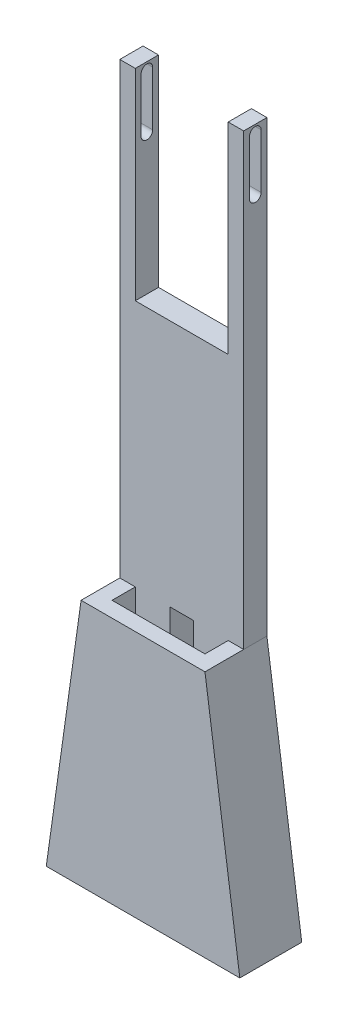
ISO-10303-21;
HEADER;
FILE_DESCRIPTION(('STEP AP214'),'2;1');
FILE_NAME('part.step','',(''),(''),'','','');
FILE_SCHEMA(('AUTOMOTIVE_DESIGN { 1 0 10303 214 1 1 1 1 }'));
ENDSEC;
DATA;
#1=APPLICATION_CONTEXT('core data for automotive mechanical design processes');
#2=APPLICATION_PROTOCOL_DEFINITION('international standard','automotive_design',2000,#1);
#3=PRODUCT_CONTEXT('',#1,'mechanical');
#4=PRODUCT('Part','Part','',(#3));
#5=PRODUCT_RELATED_PRODUCT_CATEGORY('part','',(#4));
#6=PRODUCT_DEFINITION_FORMATION('','',#4);
#7=PRODUCT_DEFINITION_CONTEXT('part definition',#1,'design');
#8=PRODUCT_DEFINITION('design','',#6,#7);
#9=PRODUCT_DEFINITION_SHAPE('','',#8);
#10=(LENGTH_UNIT() NAMED_UNIT(*) SI_UNIT(.MILLI.,.METRE.));
#11=(NAMED_UNIT(*) PLANE_ANGLE_UNIT() SI_UNIT($,.RADIAN.));
#12=(NAMED_UNIT(*) SI_UNIT($,.STERADIAN.) SOLID_ANGLE_UNIT());
#13=UNCERTAINTY_MEASURE_WITH_UNIT(LENGTH_MEASURE(1.E-05),#10,'distance_accuracy_value','');
#14=(GEOMETRIC_REPRESENTATION_CONTEXT(3) GLOBAL_UNCERTAINTY_ASSIGNED_CONTEXT((#13)) GLOBAL_UNIT_ASSIGNED_CONTEXT((#10,
#11,#12)) REPRESENTATION_CONTEXT('',''));
#15=CARTESIAN_POINT('',(0.,0.,0.));
#16=DIRECTION('',(0.,0.,1.));
#17=DIRECTION('',(1.,0.,0.));
#18=AXIS2_PLACEMENT_3D('',#15,#16,#17);
#19=CARTESIAN_POINT('',(-390.335570469799,0.,30.));
#20=DIRECTION('',(-1.,0.,0.));
#21=DIRECTION('',(0.,0.,1.));
#22=AXIS2_PLACEMENT_3D('',#19,#20,#21);
#23=PLANE('',#22);
#24=DIRECTION('',(0.,1.,0.));
#25=VECTOR('',#24,1.);
#26=CARTESIAN_POINT('',(-390.335570469799,450.408690879891,7.5));
#27=LINE('',#26,#25);
#28=CARTESIAN_POINT('',(-390.335570469799,450.408690879891,7.5));
#29=VERTEX_POINT('',#28);
#30=CARTESIAN_POINT('',(-390.335570469799,520.408690879891,7.5));
#31=VERTEX_POINT('',#30);
#32=EDGE_CURVE('E364',#29,#31,#27,.T.);
#33=ORIENTED_EDGE('',*,*,#32,.F.);
#34=CARTESIAN_POINT('',(-390.335570469799,450.408690879891,15.));
#35=DIRECTION('',(1.,0.,0.));
#36=DIRECTION('',(0.,0.,1.));
#37=AXIS2_PLACEMENT_3D('',#34,#35,#36);
#38=CIRCLE('',#37,7.5);
#39=CARTESIAN_POINT('',(-390.335570469799,450.408690879891,22.5));
#40=VERTEX_POINT('',#39);
#41=EDGE_CURVE('E360',#40,#29,#38,.T.);
#42=ORIENTED_EDGE('',*,*,#41,.F.);
#43=DIRECTION('',(0.,-1.,0.));
#44=VECTOR('',#43,1.);
#45=CARTESIAN_POINT('',(-390.335570469799,520.408690879891,22.5));
#46=LINE('',#45,#44);
#47=CARTESIAN_POINT('',(-390.335570469799,520.408690879891,22.5));
#48=VERTEX_POINT('',#47);
#49=EDGE_CURVE('E372',#48,#40,#46,.T.);
#50=ORIENTED_EDGE('',*,*,#49,.F.);
#51=CARTESIAN_POINT('',(-390.335570469799,520.408690879891,15.));
#52=DIRECTION('',(1.,0.,0.));
#53=DIRECTION('',(0.,0.,-1.));
#54=AXIS2_PLACEMENT_3D('',#51,#52,#53);
#55=CIRCLE('',#54,7.5);
#56=EDGE_CURVE('E368',#31,#48,#55,.T.);
#57=ORIENTED_EDGE('',*,*,#56,.F.);
#58=EDGE_LOOP('',(#33,#42,#50,#57));
#59=FACE_BOUND('',#58,.T.);
#60=DIRECTION('',(0.,0.,1.));
#61=VECTOR('',#60,1.);
#62=CARTESIAN_POINT('',(-390.335570469799,-49.5913091201089,0.));
#63=LINE('',#62,#61);
#64=CARTESIAN_POINT('',(-390.335570469799,-49.5913091201089,0.));
#65=VERTEX_POINT('',#64);
#66=CARTESIAN_POINT('',(-390.335570469799,-49.5913091201089,30.));
#67=VERTEX_POINT('',#66);
#68=EDGE_CURVE('E231',#65,#67,#63,.T.);
#69=ORIENTED_EDGE('',*,*,#68,.F.);
#70=DIRECTION('',(0.,1.,0.));
#71=VECTOR('',#70,1.);
#72=CARTESIAN_POINT('',(-390.335570469799,0.,0.));
#73=LINE('',#72,#71);
#74=CARTESIAN_POINT('',(-390.335570469799,530.408690879891,0.));
#75=VERTEX_POINT('',#74);
#76=EDGE_CURVE('E303',#65,#75,#73,.T.);
#77=ORIENTED_EDGE('',*,*,#76,.T.);
#78=DIRECTION('',(0.,0.,-1.));
#79=VECTOR('',#78,1.);
#80=CARTESIAN_POINT('',(-390.335570469799,530.408690879891,30.));
#81=LINE('',#80,#79);
#82=CARTESIAN_POINT('',(-390.335570469799,530.408690879891,30.));
#83=VERTEX_POINT('',#82);
#84=EDGE_CURVE('E311',#83,#75,#81,.T.);
#85=ORIENTED_EDGE('',*,*,#84,.F.);
#86=DIRECTION('',(0.,1.,0.));
#87=VECTOR('',#86,1.);
#88=CARTESIAN_POINT('',(-390.335570469799,0.,30.));
#89=LINE('',#88,#87);
#90=EDGE_CURVE('E282',#67,#83,#89,.T.);
#91=ORIENTED_EDGE('',*,*,#90,.F.);
#92=EDGE_LOOP('',(#69,#77,#85,#91));
#93=FACE_BOUND('',#92,.T.);
#94=ADVANCED_FACE('F45',(#59,#93),#23,.F.);
#95=CARTESIAN_POINT('',(-550.335570469799,-49.5913091201089,80.));
#96=DIRECTION('',(0.,-1.,0.));
#97=DIRECTION('',(0.,0.,-1.));
#98=AXIS2_PLACEMENT_3D('',#95,#96,#97);
#99=PLANE('',#98);
#100=DIRECTION('',(0.,0.,-1.));
#101=VECTOR('',#100,1.);
#102=CARTESIAN_POINT('',(-530.335570469799,-49.5913091201089,60.));
#103=LINE('',#102,#101);
#104=CARTESIAN_POINT('',(-530.335570469799,-49.5913091201089,60.));
#105=VERTEX_POINT('',#104);
#106=CARTESIAN_POINT('',(-530.335570469799,-49.5913091201089,30.));
#107=VERTEX_POINT('',#106);
#108=EDGE_CURVE('E507',#105,#107,#103,.T.);
#109=ORIENTED_EDGE('',*,*,#108,.T.);
#110=DIRECTION('',(-1.,0.,0.));
#111=VECTOR('',#110,1.);
#112=CARTESIAN_POINT('',(-550.335570469799,-49.5913091201089,30.));
#113=LINE('',#112,#111);
#114=CARTESIAN_POINT('',(-550.335570469799,-49.5913091201089,30.));
#115=VERTEX_POINT('',#114);
#116=EDGE_CURVE('E266',#107,#115,#113,.T.);
#117=ORIENTED_EDGE('',*,*,#116,.T.);
#118=DIRECTION('',(0.,0.,-1.));
#119=VECTOR('',#118,1.);
#120=CARTESIAN_POINT('',(-550.335570469799,-49.5913091201089,80.));
#121=LINE('',#120,#119);
#122=CARTESIAN_POINT('',(-550.335570469799,-49.5913091201089,80.));
#123=VERTEX_POINT('',#122);
#124=EDGE_CURVE('E238',#123,#115,#121,.T.);
#125=ORIENTED_EDGE('',*,*,#124,.F.);
#126=DIRECTION('',(-1.,0.,0.));
#127=VECTOR('',#126,1.);
#128=CARTESIAN_POINT('',(-550.335570469799,-49.5913091201089,80.));
#129=LINE('',#128,#127);
#130=CARTESIAN_POINT('',(-390.335570469799,-49.5913091201089,80.));
#131=VERTEX_POINT('',#130);
#132=EDGE_CURVE('E243',#131,#123,#129,.T.);
#133=ORIENTED_EDGE('',*,*,#132,.F.);
#134=DIRECTION('',(0.,0.,-1.));
#135=VECTOR('',#134,1.);
#136=CARTESIAN_POINT('',(-390.335570469799,-49.5913091201089,80.));
#137=LINE('',#136,#135);
#138=EDGE_CURVE('E225',#131,#67,#137,.T.);
#139=ORIENTED_EDGE('',*,*,#138,.T.);
#140=CARTESIAN_POINT('',(-410.335570469799,-49.5913091201089,30.));
#141=VERTEX_POINT('',#140);
#142=EDGE_CURVE('E261',#67,#141,#113,.T.);
#143=ORIENTED_EDGE('',*,*,#142,.T.);
#144=DIRECTION('',(0.,0.,-1.));
#145=VECTOR('',#144,1.);
#146=CARTESIAN_POINT('',(-410.335570469799,-49.5913091201089,60.));
#147=LINE('',#146,#145);
#148=CARTESIAN_POINT('',(-410.335570469799,-49.5913091201089,60.));
#149=VERTEX_POINT('',#148);
#150=EDGE_CURVE('E489',#149,#141,#147,.T.);
#151=ORIENTED_EDGE('',*,*,#150,.F.);
#152=DIRECTION('',(-1.,0.,0.));
#153=VECTOR('',#152,1.);
#154=CARTESIAN_POINT('',(-410.335570469799,-49.5913091201089,60.));
#155=LINE('',#154,#153);
#156=EDGE_CURVE('E475',#149,#105,#155,.T.);
#157=ORIENTED_EDGE('',*,*,#156,.T.);
#158=EDGE_LOOP('',(#109,#117,#125,#133,#139,#143,#151,#157));
#159=FACE_BOUND('',#158,.T.);
#160=ADVANCED_FACE('F252',(#159),#99,.F.);
#161=CARTESIAN_POINT('',(-410.335570469799,0.,30.));
#162=DIRECTION('',(-1.,0.,0.));
#163=DIRECTION('',(0.,0.,1.));
#164=AXIS2_PLACEMENT_3D('',#161,#162,#163);
#165=PLANE('',#164);
#166=DIRECTION('',(0.,1.,0.));
#167=VECTOR('',#166,1.);
#168=CARTESIAN_POINT('',(-410.335570469799,0.,0.));
#169=LINE('',#168,#167);
#170=CARTESIAN_POINT('',(-410.335570469799,270.408690879891,0.));
#171=VERTEX_POINT('',#170);
#172=CARTESIAN_POINT('',(-410.335570469799,530.408690879891,0.));
#173=VERTEX_POINT('',#172);
#174=EDGE_CURVE('E237',#171,#173,#169,.T.);
#175=ORIENTED_EDGE('',*,*,#174,.F.);
#176=DIRECTION('',(0.,0.,1.));
#177=VECTOR('',#176,1.);
#178=CARTESIAN_POINT('',(-410.335570469799,270.408690879891,0.));
#179=LINE('',#178,#177);
#180=CARTESIAN_POINT('',(-410.335570469799,270.408690879891,30.));
#181=VERTEX_POINT('',#180);
#182=EDGE_CURVE('E343',#171,#181,#179,.T.);
#183=ORIENTED_EDGE('',*,*,#182,.T.);
#184=DIRECTION('',(0.,1.,0.));
#185=VECTOR('',#184,1.);
#186=CARTESIAN_POINT('',(-410.335570469799,0.,30.));
#187=LINE('',#186,#185);
#188=CARTESIAN_POINT('',(-410.335570469799,530.408690879891,30.));
#189=VERTEX_POINT('',#188);
#190=EDGE_CURVE('E268',#181,#189,#187,.T.);
#191=ORIENTED_EDGE('',*,*,#190,.T.);
#192=DIRECTION('',(0.,0.,-1.));
#193=VECTOR('',#192,1.);
#194=CARTESIAN_POINT('',(-410.335570469799,530.408690879891,30.));
#195=LINE('',#194,#193);
#196=EDGE_CURVE('E288',#189,#173,#195,.T.);
#197=ORIENTED_EDGE('',*,*,#196,.T.);
#198=EDGE_LOOP('',(#175,#183,#191,#197));
#199=FACE_BOUND('',#198,.T.);
#200=DIRECTION('',(0.,1.,0.));
#201=VECTOR('',#200,1.);
#202=CARTESIAN_POINT('',(-410.335570469799,0.,22.5));
#203=LINE('',#202,#201);
#204=CARTESIAN_POINT('',(-410.335570469799,450.408690879891,22.5));
#205=VERTEX_POINT('',#204);
#206=CARTESIAN_POINT('',(-410.335570469799,520.408690879891,22.5));
#207=VERTEX_POINT('',#206);
#208=EDGE_CURVE('E427',#205,#207,#203,.T.);
#209=ORIENTED_EDGE('',*,*,#208,.F.);
#210=CARTESIAN_POINT('',(-410.335570469799,450.408690879891,15.));
#211=DIRECTION('',(1.,0.,0.));
#212=DIRECTION('',(0.,0.,-1.));
#213=AXIS2_PLACEMENT_3D('',#210,#211,#212);
#214=CIRCLE('',#213,7.5);
#215=CARTESIAN_POINT('',(-410.335570469799,450.408690879891,7.5));
#216=VERTEX_POINT('',#215);
#217=EDGE_CURVE('E11',#216,#205,#214,.F.);
#218=ORIENTED_EDGE('',*,*,#217,.F.);
#219=DIRECTION('',(0.,-1.,0.));
#220=VECTOR('',#219,1.);
#221=CARTESIAN_POINT('',(-410.335570469799,0.,7.5));
#222=LINE('',#221,#220);
#223=CARTESIAN_POINT('',(-410.335570469799,520.408690879891,7.5));
#224=VERTEX_POINT('',#223);
#225=EDGE_CURVE('E413',#224,#216,#222,.T.);
#226=ORIENTED_EDGE('',*,*,#225,.F.);
#227=CARTESIAN_POINT('',(-410.335570469799,520.408690879891,15.));
#228=DIRECTION('',(-1.,0.,0.));
#229=DIRECTION('',(0.,0.,1.));
#230=AXIS2_PLACEMENT_3D('',#227,#228,#229);
#231=CIRCLE('',#230,7.5);
#232=EDGE_CURVE('E420',#207,#224,#231,.T.);
#233=ORIENTED_EDGE('',*,*,#232,.F.);
#234=EDGE_LOOP('',(#209,#218,#226,#233));
#235=FACE_BOUND('',#234,.T.);
#236=ADVANCED_FACE('F47',(#199,#235),#165,.T.);
#237=CARTESIAN_POINT('',(-530.335570469799,0.,30.));
#238=DIRECTION('',(1.,0.,0.));
#239=DIRECTION('',(0.,0.,-1.));
#240=AXIS2_PLACEMENT_3D('',#237,#238,#239);
#241=PLANE('',#240);
#242=CARTESIAN_POINT('',(-530.335570469799,450.408690879891,15.));
#243=DIRECTION('',(-1.,0.,0.));
#244=DIRECTION('',(0.,0.,1.));
#245=AXIS2_PLACEMENT_3D('',#242,#243,#244);
#246=CIRCLE('',#245,7.5);
#247=CARTESIAN_POINT('',(-530.335570469799,450.408690879891,22.5));
#248=VERTEX_POINT('',#247);
#249=CARTESIAN_POINT('',(-530.335570469799,450.408690879891,7.5));
#250=VERTEX_POINT('',#249);
#251=EDGE_CURVE('E54',#248,#250,#246,.F.);
#252=ORIENTED_EDGE('',*,*,#251,.F.);
#253=DIRECTION('',(0.,-1.,0.));
#254=VECTOR('',#253,1.);
#255=CARTESIAN_POINT('',(-530.335570469799,0.,22.5));
#256=LINE('',#255,#254);
#257=CARTESIAN_POINT('',(-530.335570469799,520.408690879891,22.5));
#258=VERTEX_POINT('',#257);
#259=EDGE_CURVE('E423',#258,#248,#256,.T.);
#260=ORIENTED_EDGE('',*,*,#259,.F.);
#261=CARTESIAN_POINT('',(-530.335570469799,520.408690879891,15.));
#262=DIRECTION('',(1.,0.,0.));
#263=DIRECTION('',(0.,0.,-1.));
#264=AXIS2_PLACEMENT_3D('',#261,#262,#263);
#265=CIRCLE('',#264,7.5);
#266=CARTESIAN_POINT('',(-530.335570469799,520.408690879891,7.5));
#267=VERTEX_POINT('',#266);
#268=EDGE_CURVE('E417',#267,#258,#265,.T.);
#269=ORIENTED_EDGE('',*,*,#268,.F.);
#270=DIRECTION('',(0.,1.,0.));
#271=VECTOR('',#270,1.);
#272=CARTESIAN_POINT('',(-530.335570469799,0.,7.5));
#273=LINE('',#272,#271);
#274=EDGE_CURVE('E396',#250,#267,#273,.T.);
#275=ORIENTED_EDGE('',*,*,#274,.F.);
#276=EDGE_LOOP('',(#252,#260,#269,#275));
#277=FACE_BOUND('',#276,.T.);
#278=DIRECTION('',(0.,-1.,0.));
#279=VECTOR('',#278,1.);
#280=CARTESIAN_POINT('',(-530.335570469799,0.,30.));
#281=LINE('',#280,#279);
#282=CARTESIAN_POINT('',(-530.335570469799,530.408690879891,30.));
#283=VERTEX_POINT('',#282);
#284=CARTESIAN_POINT('',(-530.335570469799,270.408690879891,30.));
#285=VERTEX_POINT('',#284);
#286=EDGE_CURVE('E272',#283,#285,#281,.T.);
#287=ORIENTED_EDGE('',*,*,#286,.T.);
#288=DIRECTION('',(0.,0.,1.));
#289=VECTOR('',#288,1.);
#290=CARTESIAN_POINT('',(-530.335570469799,270.408690879891,0.));
#291=LINE('',#290,#289);
#292=CARTESIAN_POINT('',(-530.335570469799,270.408690879891,0.));
#293=VERTEX_POINT('',#292);
#294=EDGE_CURVE('E337',#293,#285,#291,.T.);
#295=ORIENTED_EDGE('',*,*,#294,.F.);
#296=DIRECTION('',(0.,-1.,0.));
#297=VECTOR('',#296,1.);
#298=CARTESIAN_POINT('',(-530.335570469799,0.,0.));
#299=LINE('',#298,#297);
#300=CARTESIAN_POINT('',(-530.335570469799,530.408690879891,0.));
#301=VERTEX_POINT('',#300);
#302=EDGE_CURVE('E292',#301,#293,#299,.T.);
#303=ORIENTED_EDGE('',*,*,#302,.F.);
#304=DIRECTION('',(0.,0.,-1.));
#305=VECTOR('',#304,1.);
#306=CARTESIAN_POINT('',(-530.335570469799,530.408690879891,30.));
#307=LINE('',#306,#305);
#308=EDGE_CURVE('E318',#283,#301,#307,.T.);
#309=ORIENTED_EDGE('',*,*,#308,.F.);
#310=EDGE_LOOP('',(#287,#295,#303,#309));
#311=FACE_BOUND('',#310,.T.);
#312=ADVANCED_FACE('F335',(#277,#311),#241,.T.);
#313=CARTESIAN_POINT('',(2.94435970538069E-12,530.408690879888,30.));
#314=DIRECTION('',(0.,-1.,0.));
#315=DIRECTION('',(1.,0.,0.));
#316=AXIS2_PLACEMENT_3D('',#313,#314,#315);
#317=PLANE('',#316);
#318=DIRECTION('',(-1.,0.,0.));
#319=VECTOR('',#318,1.);
#320=CARTESIAN_POINT('',(2.94435970538069E-12,530.408690879888,0.));
#321=LINE('',#320,#319);
#322=CARTESIAN_POINT('',(-550.335570469799,530.408690879891,0.));
#323=VERTEX_POINT('',#322);
#324=EDGE_CURVE('E295',#301,#323,#321,.T.);
#325=ORIENTED_EDGE('',*,*,#324,.T.);
#326=DIRECTION('',(0.,0.,-1.));
#327=VECTOR('',#326,1.);
#328=CARTESIAN_POINT('',(-550.335570469799,530.408690879891,30.));
#329=LINE('',#328,#327);
#330=CARTESIAN_POINT('',(-550.335570469799,530.408690879891,30.));
#331=VERTEX_POINT('',#330);
#332=EDGE_CURVE('E315',#331,#323,#329,.T.);
#333=ORIENTED_EDGE('',*,*,#332,.F.);
#334=DIRECTION('',(-1.,0.,0.));
#335=VECTOR('',#334,1.);
#336=CARTESIAN_POINT('',(2.94435970538069E-12,530.408690879888,30.));
#337=LINE('',#336,#335);
#338=EDGE_CURVE('E276',#283,#331,#337,.T.);
#339=ORIENTED_EDGE('',*,*,#338,.F.);
#340=ORIENTED_EDGE('',*,*,#308,.T.);
#341=EDGE_LOOP('',(#325,#333,#339,#340));
#342=FACE_BOUND('',#341,.T.);
#343=ADVANCED_FACE('F324',(#342),#317,.F.);
#344=CARTESIAN_POINT('',(-550.335570469799,0.,30.));
#345=DIRECTION('',(1.,0.,0.));
#346=DIRECTION('',(0.,0.,-1.));
#347=AXIS2_PLACEMENT_3D('',#344,#345,#346);
#348=PLANE('',#347);
#349=DIRECTION('',(0.,-1.,0.));
#350=VECTOR('',#349,1.);
#351=CARTESIAN_POINT('',(-550.335570469799,520.408690879891,22.5));
#352=LINE('',#351,#350);
#353=CARTESIAN_POINT('',(-550.335570469799,520.408690879891,22.5));
#354=VERTEX_POINT('',#353);
#355=CARTESIAN_POINT('',(-550.335570469799,450.408690879891,22.5));
#356=VERTEX_POINT('',#355);
#357=EDGE_CURVE('E388',#354,#356,#352,.T.);
#358=ORIENTED_EDGE('',*,*,#357,.T.);
#359=CARTESIAN_POINT('',(-550.335570469799,450.408690879891,15.));
#360=DIRECTION('',(1.,0.,0.));
#361=DIRECTION('',(0.,0.,1.));
#362=AXIS2_PLACEMENT_3D('',#359,#360,#361);
#363=CIRCLE('',#362,7.5);
#364=CARTESIAN_POINT('',(-550.335570469799,450.408690879891,7.5));
#365=VERTEX_POINT('',#364);
#366=EDGE_CURVE('E376',#356,#365,#363,.T.);
#367=ORIENTED_EDGE('',*,*,#366,.T.);
#368=DIRECTION('',(0.,1.,0.));
#369=VECTOR('',#368,1.);
#370=CARTESIAN_POINT('',(-550.335570469799,450.408690879891,7.5));
#371=LINE('',#370,#369);
#372=CARTESIAN_POINT('',(-550.335570469799,520.408690879891,7.5));
#373=VERTEX_POINT('',#372);
#374=EDGE_CURVE('E380',#365,#373,#371,.T.);
#375=ORIENTED_EDGE('',*,*,#374,.T.);
#376=CARTESIAN_POINT('',(-550.335570469799,520.408690879891,15.));
#377=DIRECTION('',(1.,0.,0.));
#378=DIRECTION('',(0.,0.,-1.));
#379=AXIS2_PLACEMENT_3D('',#376,#377,#378);
#380=CIRCLE('',#379,7.5);
#381=EDGE_CURVE('E384',#373,#354,#380,.T.);
#382=ORIENTED_EDGE('',*,*,#381,.T.);
#383=EDGE_LOOP('',(#358,#367,#375,#382));
#384=FACE_BOUND('',#383,.T.);
#385=DIRECTION('',(0.,-1.,0.));
#386=VECTOR('',#385,1.);
#387=CARTESIAN_POINT('',(-550.335570469799,0.,0.));
#388=LINE('',#387,#386);
#389=CARTESIAN_POINT('',(-550.335570469799,-49.5913091201089,0.));
#390=VERTEX_POINT('',#389);
#391=EDGE_CURVE('E61',#323,#390,#388,.T.);
#392=ORIENTED_EDGE('',*,*,#391,.T.);
#393=DIRECTION('',(0.,0.,1.));
#394=VECTOR('',#393,1.);
#395=CARTESIAN_POINT('',(-550.335570469799,-49.5913091201089,0.));
#396=LINE('',#395,#394);
#397=EDGE_CURVE('E356',#390,#115,#396,.T.);
#398=ORIENTED_EDGE('',*,*,#397,.T.);
#399=DIRECTION('',(0.,-1.,0.));
#400=VECTOR('',#399,1.);
#401=CARTESIAN_POINT('',(-550.335570469799,0.,30.));
#402=LINE('',#401,#400);
#403=EDGE_CURVE('E279',#331,#115,#402,.T.);
#404=ORIENTED_EDGE('',*,*,#403,.F.);
#405=ORIENTED_EDGE('',*,*,#332,.T.);
#406=EDGE_LOOP('',(#392,#398,#404,#405));
#407=FACE_BOUND('',#406,.T.);
#408=ADVANCED_FACE('F514',(#384,#407),#348,.F.);
#409=CARTESIAN_POINT('',(0.,-369.591309120109,30.));
#410=DIRECTION('',(0.,1.,0.));
#411=DIRECTION('',(0.,0.,1.));
#412=AXIS2_PLACEMENT_3D('',#409,#410,#411);
#413=PLANE('',#412);
#414=DIRECTION('',(1.,0.,0.));
#415=VECTOR('',#414,1.);
#416=CARTESIAN_POINT('',(0.,-369.591309120109,0.));
#417=LINE('',#416,#415);
#418=CARTESIAN_POINT('',(-595.335570469799,-369.591309120109,0.));
#419=VERTEX_POINT('',#418);
#420=CARTESIAN_POINT('',(-345.335570469799,-369.591309120109,0.));
#421=VERTEX_POINT('',#420);
#422=EDGE_CURVE('E300',#419,#421,#417,.T.);
#423=ORIENTED_EDGE('',*,*,#422,.T.);
#424=DIRECTION('',(0.,0.,1.));
#425=VECTOR('',#424,1.);
#426=CARTESIAN_POINT('',(-345.335570469799,-369.591309120109,0.));
#427=LINE('',#426,#425);
#428=CARTESIAN_POINT('',(-345.335570469799,-369.591309120109,80.));
#429=VERTEX_POINT('',#428);
#430=EDGE_CURVE('E529',#421,#429,#427,.T.);
#431=ORIENTED_EDGE('',*,*,#430,.T.);
#432=DIRECTION('',(1.,0.,0.));
#433=VECTOR('',#432,1.);
#434=CARTESIAN_POINT('',(-390.335570469799,-369.591309120109,80.));
#435=LINE('',#434,#433);
#436=CARTESIAN_POINT('',(-595.335570469799,-369.591309120109,80.));
#437=VERTEX_POINT('',#436);
#438=EDGE_CURVE('E245',#437,#429,#435,.T.);
#439=ORIENTED_EDGE('',*,*,#438,.F.);
#440=DIRECTION('',(0.,0.,1.));
#441=VECTOR('',#440,1.);
#442=CARTESIAN_POINT('',(-595.335570469799,-369.591309120109,0.));
#443=LINE('',#442,#441);
#444=EDGE_CURVE('E353',#419,#437,#443,.T.);
#445=ORIENTED_EDGE('',*,*,#444,.F.);
#446=EDGE_LOOP('',(#423,#431,#439,#445));
#447=FACE_BOUND('',#446,.T.);
#448=ADVANCED_FACE('F535',(#447),#413,.F.);
#449=CARTESIAN_POINT('',(0.,530.408690879891,30.));
#450=DIRECTION('',(0.,-1.,0.));
#451=DIRECTION('',(0.,0.,-1.));
#452=AXIS2_PLACEMENT_3D('',#449,#450,#451);
#453=PLANE('',#452);
#454=DIRECTION('',(-1.,0.,0.));
#455=VECTOR('',#454,1.);
#456=CARTESIAN_POINT('',(0.,530.408690879891,0.));
#457=LINE('',#456,#455);
#458=EDGE_CURVE('E273',#75,#173,#457,.T.);
#459=ORIENTED_EDGE('',*,*,#458,.T.);
#460=ORIENTED_EDGE('',*,*,#196,.F.);
#461=DIRECTION('',(-1.,0.,0.));
#462=VECTOR('',#461,1.);
#463=CARTESIAN_POINT('',(0.,530.408690879891,30.));
#464=LINE('',#463,#462);
#465=EDGE_CURVE('E285',#83,#189,#464,.T.);
#466=ORIENTED_EDGE('',*,*,#465,.F.);
#467=ORIENTED_EDGE('',*,*,#84,.T.);
#468=EDGE_LOOP('',(#459,#460,#466,#467));
#469=FACE_BOUND('',#468,.T.);
#470=ADVANCED_FACE('F544',(#469),#453,.F.);
#471=CARTESIAN_POINT('',(0.,0.,30.));
#472=DIRECTION('',(0.,0.,1.));
#473=DIRECTION('',(1.,0.,0.));
#474=AXIS2_PLACEMENT_3D('',#471,#472,#473);
#475=PLANE('',#474);
#476=DIRECTION('',(1.,0.,0.));
#477=VECTOR('',#476,1.);
#478=CARTESIAN_POINT('',(-530.335570469799,270.408690879891,30.));
#479=LINE('',#478,#477);
#480=EDGE_CURVE('E350',#285,#181,#479,.T.);
#481=ORIENTED_EDGE('',*,*,#480,.F.);
#482=ORIENTED_EDGE('',*,*,#286,.F.);
#483=ORIENTED_EDGE('',*,*,#338,.T.);
#484=ORIENTED_EDGE('',*,*,#403,.T.);
#485=ORIENTED_EDGE('',*,*,#116,.F.);
#486=DIRECTION('',(0.,-1.,0.));
#487=VECTOR('',#486,1.);
#488=CARTESIAN_POINT('',(-530.335570469799,-49.5913091201089,30.));
#489=LINE('',#488,#487);
#490=CARTESIAN_POINT('',(-530.335570469799,-349.591309120109,30.));
#491=VERTEX_POINT('',#490);
#492=EDGE_CURVE('E465',#107,#491,#489,.T.);
#493=ORIENTED_EDGE('',*,*,#492,.T.);
#494=DIRECTION('',(1.,0.,0.));
#495=VECTOR('',#494,1.);
#496=CARTESIAN_POINT('',(-530.335570469799,-349.591309120109,30.));
#497=LINE('',#496,#495);
#498=CARTESIAN_POINT('',(-410.335570469799,-349.591309120109,30.));
#499=VERTEX_POINT('',#498);
#500=EDGE_CURVE('E492',#491,#499,#497,.T.);
#501=ORIENTED_EDGE('',*,*,#500,.T.);
#502=DIRECTION('',(0.,1.,0.));
#503=VECTOR('',#502,1.);
#504=CARTESIAN_POINT('',(-410.335570469799,-349.591309120109,30.));
#505=LINE('',#504,#503);
#506=EDGE_CURVE('E480',#499,#141,#505,.T.);
#507=ORIENTED_EDGE('',*,*,#506,.T.);
#508=ORIENTED_EDGE('',*,*,#142,.F.);
#509=ORIENTED_EDGE('',*,*,#90,.T.);
#510=ORIENTED_EDGE('',*,*,#465,.T.);
#511=ORIENTED_EDGE('',*,*,#190,.F.);
#512=EDGE_LOOP('',(#481,#482,#483,#484,#485,#493,#501,#507,#508,#509,#510,#511));
#513=FACE_BOUND('',#512,.T.);
#514=DIRECTION('',(-1.,0.,0.));
#515=VECTOR('',#514,1.);
#516=CARTESIAN_POINT('',(-455.335570469799,-49.5913091201089,30.));
#517=LINE('',#516,#515);
#518=CARTESIAN_POINT('',(-455.335570469799,-49.5913091201089,30.));
#519=VERTEX_POINT('',#518);
#520=CARTESIAN_POINT('',(-485.335570469799,-49.5913091201089,30.));
#521=VERTEX_POINT('',#520);
#522=EDGE_CURVE('E430',#519,#521,#517,.T.);
#523=ORIENTED_EDGE('',*,*,#522,.F.);
#524=DIRECTION('',(0.,1.,0.));
#525=VECTOR('',#524,1.);
#526=CARTESIAN_POINT('',(-455.335570469799,-329.591309120109,30.));
#527=LINE('',#526,#525);
#528=CARTESIAN_POINT('',(-455.335570469799,-329.591309120109,30.));
#529=VERTEX_POINT('',#528);
#530=EDGE_CURVE('E436',#529,#519,#527,.T.);
#531=ORIENTED_EDGE('',*,*,#530,.F.);
#532=DIRECTION('',(1.,0.,0.));
#533=VECTOR('',#532,1.);
#534=CARTESIAN_POINT('',(-485.335570469799,-329.591309120109,30.));
#535=LINE('',#534,#533);
#536=CARTESIAN_POINT('',(-485.335570469799,-329.591309120109,30.));
#537=VERTEX_POINT('',#536);
#538=EDGE_CURVE('E455',#537,#529,#535,.T.);
#539=ORIENTED_EDGE('',*,*,#538,.F.);
#540=DIRECTION('',(0.,-1.,0.));
#541=VECTOR('',#540,1.);
#542=CARTESIAN_POINT('',(-485.335570469799,-49.5913091201089,30.));
#543=LINE('',#542,#541);
#544=EDGE_CURVE('E451',#521,#537,#543,.T.);
#545=ORIENTED_EDGE('',*,*,#544,.F.);
#546=EDGE_LOOP('',(#523,#531,#539,#545));
#547=FACE_BOUND('',#546,.T.);
#548=ADVANCED_FACE('F546',(#513,#547),#475,.T.);
#549=CARTESIAN_POINT('',(0.,0.,0.));
#550=DIRECTION('',(0.,0.,1.));
#551=DIRECTION('',(1.,0.,0.));
#552=AXIS2_PLACEMENT_3D('',#549,#550,#551);
#553=PLANE('',#552);
#554=ORIENTED_EDGE('',*,*,#302,.T.);
#555=DIRECTION('',(1.,0.,0.));
#556=VECTOR('',#555,1.);
#557=CARTESIAN_POINT('',(-530.335570469799,270.408690879891,0.));
#558=LINE('',#557,#556);
#559=EDGE_CURVE('E344',#293,#171,#558,.T.);
#560=ORIENTED_EDGE('',*,*,#559,.T.);
#561=ORIENTED_EDGE('',*,*,#174,.T.);
#562=ORIENTED_EDGE('',*,*,#458,.F.);
#563=ORIENTED_EDGE('',*,*,#76,.F.);
#564=DIRECTION('',(-0.139254831399099,0.990256578838035,0.));
#565=VECTOR('',#564,1.);
#566=CARTESIAN_POINT('',(-345.335570469799,-369.591309120109,0.));
#567=LINE('',#566,#565);
#568=EDGE_CURVE('E249',#421,#65,#567,.T.);
#569=ORIENTED_EDGE('',*,*,#568,.F.);
#570=ORIENTED_EDGE('',*,*,#422,.F.);
#571=DIRECTION('',(-0.139254831399099,-0.990256578838035,0.));
#572=VECTOR('',#571,1.);
#573=CARTESIAN_POINT('',(-595.335570469799,-369.591309120109,0.));
#574=LINE('',#573,#572);
#575=EDGE_CURVE('E518',#390,#419,#574,.T.);
#576=ORIENTED_EDGE('',*,*,#575,.F.);
#577=ORIENTED_EDGE('',*,*,#391,.F.);
#578=ORIENTED_EDGE('',*,*,#324,.F.);
#579=EDGE_LOOP('',(#554,#560,#561,#562,#563,#569,#570,#576,#577,#578));
#580=FACE_BOUND('',#579,.T.);
#581=DIRECTION('',(0.,1.,0.));
#582=VECTOR('',#581,1.);
#583=CARTESIAN_POINT('',(-455.335570469799,-329.591309120109,0.));
#584=LINE('',#583,#582);
#585=CARTESIAN_POINT('',(-455.335570469799,-329.591309120109,0.));
#586=VERTEX_POINT('',#585);
#587=CARTESIAN_POINT('',(-455.335570469799,-49.5913091201089,0.));
#588=VERTEX_POINT('',#587);
#589=EDGE_CURVE('E444',#586,#588,#584,.T.);
#590=ORIENTED_EDGE('',*,*,#589,.T.);
#591=DIRECTION('',(-1.,0.,0.));
#592=VECTOR('',#591,1.);
#593=CARTESIAN_POINT('',(-455.335570469799,-49.5913091201089,0.));
#594=LINE('',#593,#592);
#595=CARTESIAN_POINT('',(-485.335570469799,-49.5913091201089,0.));
#596=VERTEX_POINT('',#595);
#597=EDGE_CURVE('E431',#588,#596,#594,.T.);
#598=ORIENTED_EDGE('',*,*,#597,.T.);
#599=DIRECTION('',(0.,-1.,0.));
#600=VECTOR('',#599,1.);
#601=CARTESIAN_POINT('',(-485.335570469799,-49.5913091201089,0.));
#602=LINE('',#601,#600);
#603=CARTESIAN_POINT('',(-485.335570469799,-329.591309120109,0.));
#604=VERTEX_POINT('',#603);
#605=EDGE_CURVE('E435',#596,#604,#602,.T.);
#606=ORIENTED_EDGE('',*,*,#605,.T.);
#607=DIRECTION('',(1.,0.,0.));
#608=VECTOR('',#607,1.);
#609=CARTESIAN_POINT('',(-485.335570469799,-329.591309120109,0.));
#610=LINE('',#609,#608);
#611=EDGE_CURVE('E440',#604,#586,#610,.T.);
#612=ORIENTED_EDGE('',*,*,#611,.T.);
#613=EDGE_LOOP('',(#590,#598,#606,#612));
#614=FACE_BOUND('',#613,.T.);
#615=ADVANCED_FACE('F330',(#580,#614),#553,.F.);
#616=CARTESIAN_POINT('',(0.,0.,80.));
#617=DIRECTION('',(0.,0.,-1.));
#618=DIRECTION('',(-1.,0.,0.));
#619=AXIS2_PLACEMENT_3D('',#616,#617,#618);
#620=PLANE('',#619);
#621=ORIENTED_EDGE('',*,*,#438,.T.);
#622=DIRECTION('',(-0.139254831399099,0.990256578838035,0.));
#623=VECTOR('',#622,1.);
#624=CARTESIAN_POINT('',(-345.335570469799,-369.591309120109,80.));
#625=LINE('',#624,#623);
#626=EDGE_CURVE('E229',#429,#131,#625,.T.);
#627=ORIENTED_EDGE('',*,*,#626,.T.);
#628=ORIENTED_EDGE('',*,*,#132,.T.);
#629=DIRECTION('',(-0.139254831399099,-0.990256578838035,0.));
#630=VECTOR('',#629,1.);
#631=CARTESIAN_POINT('',(-595.335570469799,-369.591309120109,80.));
#632=LINE('',#631,#630);
#633=EDGE_CURVE('E248',#123,#437,#632,.T.);
#634=ORIENTED_EDGE('',*,*,#633,.T.);
#635=EDGE_LOOP('',(#621,#627,#628,#634));
#636=FACE_BOUND('',#635,.T.);
#637=ADVANCED_FACE('F241',(#636),#620,.F.);
#638=CARTESIAN_POINT('',(-530.335570469799,-49.5913091201089,60.));
#639=DIRECTION('',(1.,0.,0.));
#640=DIRECTION('',(0.,0.,-1.));
#641=AXIS2_PLACEMENT_3D('',#638,#639,#640);
#642=PLANE('',#641);
#643=ORIENTED_EDGE('',*,*,#492,.F.);
#644=ORIENTED_EDGE('',*,*,#108,.F.);
#645=DIRECTION('',(0.,-1.,0.));
#646=VECTOR('',#645,1.);
#647=CARTESIAN_POINT('',(-530.335570469799,-49.5913091201089,60.));
#648=LINE('',#647,#646);
#649=CARTESIAN_POINT('',(-530.335570469799,-349.591309120109,60.));
#650=VERTEX_POINT('',#649);
#651=EDGE_CURVE('E479',#105,#650,#648,.T.);
#652=ORIENTED_EDGE('',*,*,#651,.T.);
#653=DIRECTION('',(0.,0.,-1.));
#654=VECTOR('',#653,1.);
#655=CARTESIAN_POINT('',(-530.335570469799,-349.591309120109,60.));
#656=LINE('',#655,#654);
#657=EDGE_CURVE('E504',#650,#491,#656,.T.);
#658=ORIENTED_EDGE('',*,*,#657,.T.);
#659=EDGE_LOOP('',(#643,#644,#652,#658));
#660=FACE_BOUND('',#659,.T.);
#661=ADVANCED_FACE('F560',(#660),#642,.T.);
#662=CARTESIAN_POINT('',(-530.335570469799,-349.591309120109,60.));
#663=DIRECTION('',(0.,1.,0.));
#664=DIRECTION('',(0.,0.,1.));
#665=AXIS2_PLACEMENT_3D('',#662,#663,#664);
#666=PLANE('',#665);
#667=ORIENTED_EDGE('',*,*,#500,.F.);
#668=ORIENTED_EDGE('',*,*,#657,.F.);
#669=DIRECTION('',(1.,0.,0.));
#670=VECTOR('',#669,1.);
#671=CARTESIAN_POINT('',(-530.335570469799,-349.591309120109,60.));
#672=LINE('',#671,#670);
#673=CARTESIAN_POINT('',(-410.335570469799,-349.591309120109,60.));
#674=VERTEX_POINT('',#673);
#675=EDGE_CURVE('E483',#650,#674,#672,.T.);
#676=ORIENTED_EDGE('',*,*,#675,.T.);
#677=DIRECTION('',(0.,0.,-1.));
#678=VECTOR('',#677,1.);
#679=CARTESIAN_POINT('',(-410.335570469799,-349.591309120109,60.));
#680=LINE('',#679,#678);
#681=EDGE_CURVE('E500',#674,#499,#680,.T.);
#682=ORIENTED_EDGE('',*,*,#681,.T.);
#683=EDGE_LOOP('',(#667,#668,#676,#682));
#684=FACE_BOUND('',#683,.T.);
#685=ADVANCED_FACE('F563',(#684),#666,.T.);
#686=CARTESIAN_POINT('',(-410.335570469799,-349.591309120109,60.));
#687=DIRECTION('',(-1.,0.,0.));
#688=DIRECTION('',(0.,0.,1.));
#689=AXIS2_PLACEMENT_3D('',#686,#687,#688);
#690=PLANE('',#689);
#691=ORIENTED_EDGE('',*,*,#506,.F.);
#692=ORIENTED_EDGE('',*,*,#681,.F.);
#693=DIRECTION('',(0.,1.,0.));
#694=VECTOR('',#693,1.);
#695=CARTESIAN_POINT('',(-410.335570469799,-349.591309120109,60.));
#696=LINE('',#695,#694);
#697=EDGE_CURVE('E486',#674,#149,#696,.T.);
#698=ORIENTED_EDGE('',*,*,#697,.T.);
#699=ORIENTED_EDGE('',*,*,#150,.T.);
#700=EDGE_LOOP('',(#691,#692,#698,#699));
#701=FACE_BOUND('',#700,.T.);
#702=ADVANCED_FACE('F552',(#701),#690,.T.);
#703=CARTESIAN_POINT('',(0.,0.,60.));
#704=DIRECTION('',(0.,0.,1.));
#705=DIRECTION('',(1.,0.,0.));
#706=AXIS2_PLACEMENT_3D('',#703,#704,#705);
#707=PLANE('',#706);
#708=ORIENTED_EDGE('',*,*,#156,.F.);
#709=ORIENTED_EDGE('',*,*,#697,.F.);
#710=ORIENTED_EDGE('',*,*,#675,.F.);
#711=ORIENTED_EDGE('',*,*,#651,.F.);
#712=EDGE_LOOP('',(#708,#709,#710,#711));
#713=FACE_BOUND('',#712,.T.);
#714=ADVANCED_FACE('F557',(#713),#707,.F.);
#715=CARTESIAN_POINT('',(-455.335570469799,-49.5913091201089,0.));
#716=DIRECTION('',(0.,1.,0.));
#717=DIRECTION('',(-1.,0.,0.));
#718=AXIS2_PLACEMENT_3D('',#715,#716,#717);
#719=PLANE('',#718);
#720=ORIENTED_EDGE('',*,*,#522,.T.);
#721=DIRECTION('',(0.,0.,1.));
#722=VECTOR('',#721,1.);
#723=CARTESIAN_POINT('',(-485.335570469799,-49.5913091201089,0.));
#724=LINE('',#723,#722);
#725=EDGE_CURVE('E448',#596,#521,#724,.T.);
#726=ORIENTED_EDGE('',*,*,#725,.F.);
#727=ORIENTED_EDGE('',*,*,#597,.F.);
#728=DIRECTION('',(0.,0.,1.));
#729=VECTOR('',#728,1.);
#730=CARTESIAN_POINT('',(-455.335570469799,-49.5913091201089,0.));
#731=LINE('',#730,#729);
#732=EDGE_CURVE('E462',#588,#519,#731,.T.);
#733=ORIENTED_EDGE('',*,*,#732,.T.);
#734=EDGE_LOOP('',(#720,#726,#727,#733));
#735=FACE_BOUND('',#734,.T.);
#736=ADVANCED_FACE('F667',(#735),#719,.F.);
#737=CARTESIAN_POINT('',(-455.335570469799,-329.591309120109,0.));
#738=DIRECTION('',(1.,0.,0.));
#739=DIRECTION('',(0.,0.,-1.));
#740=AXIS2_PLACEMENT_3D('',#737,#738,#739);
#741=PLANE('',#740);
#742=ORIENTED_EDGE('',*,*,#530,.T.);
#743=ORIENTED_EDGE('',*,*,#732,.F.);
#744=ORIENTED_EDGE('',*,*,#589,.F.);
#745=DIRECTION('',(0.,0.,1.));
#746=VECTOR('',#745,1.);
#747=CARTESIAN_POINT('',(-455.335570469799,-329.591309120109,0.));
#748=LINE('',#747,#746);
#749=EDGE_CURVE('E466',#586,#529,#748,.T.);
#750=ORIENTED_EDGE('',*,*,#749,.T.);
#751=EDGE_LOOP('',(#742,#743,#744,#750));
#752=FACE_BOUND('',#751,.T.);
#753=ADVANCED_FACE('F664',(#752),#741,.F.);
#754=CARTESIAN_POINT('',(-485.335570469799,-329.591309120109,0.));
#755=DIRECTION('',(0.,-1.,0.));
#756=DIRECTION('',(0.,0.,-1.));
#757=AXIS2_PLACEMENT_3D('',#754,#755,#756);
#758=PLANE('',#757);
#759=ORIENTED_EDGE('',*,*,#538,.T.);
#760=ORIENTED_EDGE('',*,*,#749,.F.);
#761=ORIENTED_EDGE('',*,*,#611,.F.);
#762=DIRECTION('',(0.,0.,1.));
#763=VECTOR('',#762,1.);
#764=CARTESIAN_POINT('',(-485.335570469799,-329.591309120109,0.));
#765=LINE('',#764,#763);
#766=EDGE_CURVE('E469',#604,#537,#765,.T.);
#767=ORIENTED_EDGE('',*,*,#766,.T.);
#768=EDGE_LOOP('',(#759,#760,#761,#767));
#769=FACE_BOUND('',#768,.T.);
#770=ADVANCED_FACE('F630',(#769),#758,.F.);
#771=CARTESIAN_POINT('',(-485.335570469799,-49.5913091201089,0.));
#772=DIRECTION('',(-1.,0.,0.));
#773=DIRECTION('',(0.,0.,1.));
#774=AXIS2_PLACEMENT_3D('',#771,#772,#773);
#775=PLANE('',#774);
#776=ORIENTED_EDGE('',*,*,#544,.T.);
#777=ORIENTED_EDGE('',*,*,#766,.F.);
#778=ORIENTED_EDGE('',*,*,#605,.F.);
#779=ORIENTED_EDGE('',*,*,#725,.T.);
#780=EDGE_LOOP('',(#776,#777,#778,#779));
#781=FACE_BOUND('',#780,.T.);
#782=ADVANCED_FACE('F622',(#781),#775,.F.);
#783=CARTESIAN_POINT('',(-550.335570469799,450.408690879891,7.5));
#784=DIRECTION('',(0.,0.,-1.));
#785=DIRECTION('',(-1.,0.,0.));
#786=AXIS2_PLACEMENT_3D('',#783,#784,#785);
#787=PLANE('',#786);
#788=ORIENTED_EDGE('',*,*,#225,.T.);
#789=DIRECTION('',(1.,0.,0.));
#790=VECTOR('',#789,1.);
#791=CARTESIAN_POINT('',(-550.335570469799,450.408690879891,7.5));
#792=LINE('',#791,#790);
#793=EDGE_CURVE('E392',#216,#29,#792,.T.);
#794=ORIENTED_EDGE('',*,*,#793,.T.);
#795=ORIENTED_EDGE('',*,*,#32,.T.);
#796=DIRECTION('',(1.,0.,0.));
#797=VECTOR('',#796,1.);
#798=CARTESIAN_POINT('',(-550.335570469799,520.408690879891,7.5));
#799=LINE('',#798,#797);
#800=EDGE_CURVE('E407',#224,#31,#799,.T.);
#801=ORIENTED_EDGE('',*,*,#800,.F.);
#802=EDGE_LOOP('',(#788,#794,#795,#801));
#803=FACE_BOUND('',#802,.T.);
#804=ADVANCED_FACE('F612',(#803),#787,.F.);
#805=CARTESIAN_POINT('',(-550.335570469799,520.408690879891,15.));
#806=DIRECTION('',(1.,0.,0.));
#807=DIRECTION('',(0.,0.,-1.));
#808=AXIS2_PLACEMENT_3D('',#805,#806,#807);
#809=CYLINDRICAL_SURFACE('',#808,7.5);
#810=ORIENTED_EDGE('',*,*,#232,.T.);
#811=ORIENTED_EDGE('',*,*,#800,.T.);
#812=ORIENTED_EDGE('',*,*,#56,.T.);
#813=DIRECTION('',(1.,0.,0.));
#814=VECTOR('',#813,1.);
#815=CARTESIAN_POINT('',(-550.335570469799,520.408690879891,22.5));
#816=LINE('',#815,#814);
#817=EDGE_CURVE('E402',#207,#48,#816,.T.);
#818=ORIENTED_EDGE('',*,*,#817,.F.);
#819=EDGE_LOOP('',(#810,#811,#812,#818));
#820=FACE_BOUND('',#819,.T.);
#821=ADVANCED_FACE('F619',(#820),#809,.F.);
#822=CARTESIAN_POINT('',(-550.335570469799,520.408690879891,22.5));
#823=DIRECTION('',(0.,0.,1.));
#824=DIRECTION('',(1.,0.,0.));
#825=AXIS2_PLACEMENT_3D('',#822,#823,#824);
#826=PLANE('',#825);
#827=ORIENTED_EDGE('',*,*,#208,.T.);
#828=ORIENTED_EDGE('',*,*,#817,.T.);
#829=ORIENTED_EDGE('',*,*,#49,.T.);
#830=DIRECTION('',(1.,0.,0.));
#831=VECTOR('',#830,1.);
#832=CARTESIAN_POINT('',(-550.335570469799,450.408690879891,22.5));
#833=LINE('',#832,#831);
#834=EDGE_CURVE('E397',#205,#40,#833,.T.);
#835=ORIENTED_EDGE('',*,*,#834,.F.);
#836=EDGE_LOOP('',(#827,#828,#829,#835));
#837=FACE_BOUND('',#836,.T.);
#838=ADVANCED_FACE('F628',(#837),#826,.F.);
#839=CARTESIAN_POINT('',(-550.335570469799,450.408690879891,15.));
#840=DIRECTION('',(1.,0.,0.));
#841=DIRECTION('',(0.,0.,-1.));
#842=AXIS2_PLACEMENT_3D('',#839,#840,#841);
#843=CYLINDRICAL_SURFACE('',#842,7.5);
#844=ORIENTED_EDGE('',*,*,#793,.F.);
#845=ORIENTED_EDGE('',*,*,#217,.T.);
#846=ORIENTED_EDGE('',*,*,#834,.T.);
#847=ORIENTED_EDGE('',*,*,#41,.T.);
#848=EDGE_LOOP('',(#844,#845,#846,#847));
#849=FACE_BOUND('',#848,.T.);
#850=ADVANCED_FACE('F642',(#849),#843,.F.);
#851=EDGE_CURVE('E393',#356,#248,#833,.T.);
#852=ORIENTED_EDGE('',*,*,#851,.T.);
#853=ORIENTED_EDGE('',*,*,#251,.T.);
#854=EDGE_CURVE('E408',#365,#250,#792,.T.);
#855=ORIENTED_EDGE('',*,*,#854,.F.);
#856=ORIENTED_EDGE('',*,*,#366,.F.);
#857=EDGE_LOOP('',(#852,#853,#855,#856));
#858=FACE_BOUND('',#857,.T.);
#859=ADVANCED_FACE('F603',(#858),#843,.F.);
#860=ORIENTED_EDGE('',*,*,#259,.T.);
#861=ORIENTED_EDGE('',*,*,#851,.F.);
#862=ORIENTED_EDGE('',*,*,#357,.F.);
#863=EDGE_CURVE('E398',#354,#258,#816,.T.);
#864=ORIENTED_EDGE('',*,*,#863,.T.);
#865=EDGE_LOOP('',(#860,#861,#862,#864));
#866=FACE_BOUND('',#865,.T.);
#867=ADVANCED_FACE('F600',(#866),#826,.F.);
#868=ORIENTED_EDGE('',*,*,#268,.T.);
#869=ORIENTED_EDGE('',*,*,#863,.F.);
#870=ORIENTED_EDGE('',*,*,#381,.F.);
#871=EDGE_CURVE('E403',#373,#267,#799,.T.);
#872=ORIENTED_EDGE('',*,*,#871,.T.);
#873=EDGE_LOOP('',(#868,#869,#870,#872));
#874=FACE_BOUND('',#873,.T.);
#875=ADVANCED_FACE('F607',(#874),#809,.F.);
#876=ORIENTED_EDGE('',*,*,#274,.T.);
#877=ORIENTED_EDGE('',*,*,#871,.F.);
#878=ORIENTED_EDGE('',*,*,#374,.F.);
#879=ORIENTED_EDGE('',*,*,#854,.T.);
#880=EDGE_LOOP('',(#876,#877,#878,#879));
#881=FACE_BOUND('',#880,.T.);
#882=ADVANCED_FACE('F609',(#881),#787,.F.);
#883=CARTESIAN_POINT('',(-530.335570469799,270.408690879891,0.));
#884=DIRECTION('',(0.,-1.,0.));
#885=DIRECTION('',(0.,0.,-1.));
#886=AXIS2_PLACEMENT_3D('',#883,#884,#885);
#887=PLANE('',#886);
#888=ORIENTED_EDGE('',*,*,#480,.T.);
#889=ORIENTED_EDGE('',*,*,#182,.F.);
#890=ORIENTED_EDGE('',*,*,#559,.F.);
#891=ORIENTED_EDGE('',*,*,#294,.T.);
#892=EDGE_LOOP('',(#888,#889,#890,#891));
#893=FACE_BOUND('',#892,.T.);
#894=ADVANCED_FACE('F347',(#893),#887,.F.);
#895=CARTESIAN_POINT('',(-595.335570469799,-369.591309120109,0.));
#896=DIRECTION('',(-0.990256578838035,0.139254831399099,0.));
#897=DIRECTION('',(-0.139254831399099,-0.990256578838035,0.));
#898=AXIS2_PLACEMENT_3D('',#895,#896,#897);
#899=PLANE('',#898);
#900=ORIENTED_EDGE('',*,*,#633,.F.);
#901=ORIENTED_EDGE('',*,*,#124,.T.);
#902=ORIENTED_EDGE('',*,*,#397,.F.);
#903=ORIENTED_EDGE('',*,*,#575,.T.);
#904=ORIENTED_EDGE('',*,*,#444,.T.);
#905=EDGE_LOOP('',(#900,#901,#902,#903,#904));
#906=FACE_BOUND('',#905,.T.);
#907=ADVANCED_FACE('F519',(#906),#899,.T.);
#908=CARTESIAN_POINT('',(-345.335570469799,-369.591309120109,0.));
#909=DIRECTION('',(0.990256578838035,0.139254831399099,0.));
#910=DIRECTION('',(-0.139254831399099,0.990256578838035,0.));
#911=AXIS2_PLACEMENT_3D('',#908,#909,#910);
#912=PLANE('',#911);
#913=ORIENTED_EDGE('',*,*,#626,.F.);
#914=ORIENTED_EDGE('',*,*,#430,.F.);
#915=ORIENTED_EDGE('',*,*,#568,.T.);
#916=ORIENTED_EDGE('',*,*,#68,.T.);
#917=ORIENTED_EDGE('',*,*,#138,.F.);
#918=EDGE_LOOP('',(#913,#914,#915,#916,#917));
#919=FACE_BOUND('',#918,.T.);
#920=ADVANCED_FACE('F227',(#919),#912,.T.);
#921=CLOSED_SHELL('',(#94,#160,#236,#312,#343,#408,#448,#470,#548,#615,#637,#661,#685,#702,#714,
#736,#753,#770,#782,#804,#821,#838,#850,#859,#867,#875,#882,#894,#907,#920));
#922=MANIFOLD_SOLID_BREP('B2',#921);
#923=ADVANCED_BREP_SHAPE_REPRESENTATION('',(#18,#922),#14);
#924=SHAPE_DEFINITION_REPRESENTATION(#9,#923);
ENDSEC;
END-ISO-10303-21;
